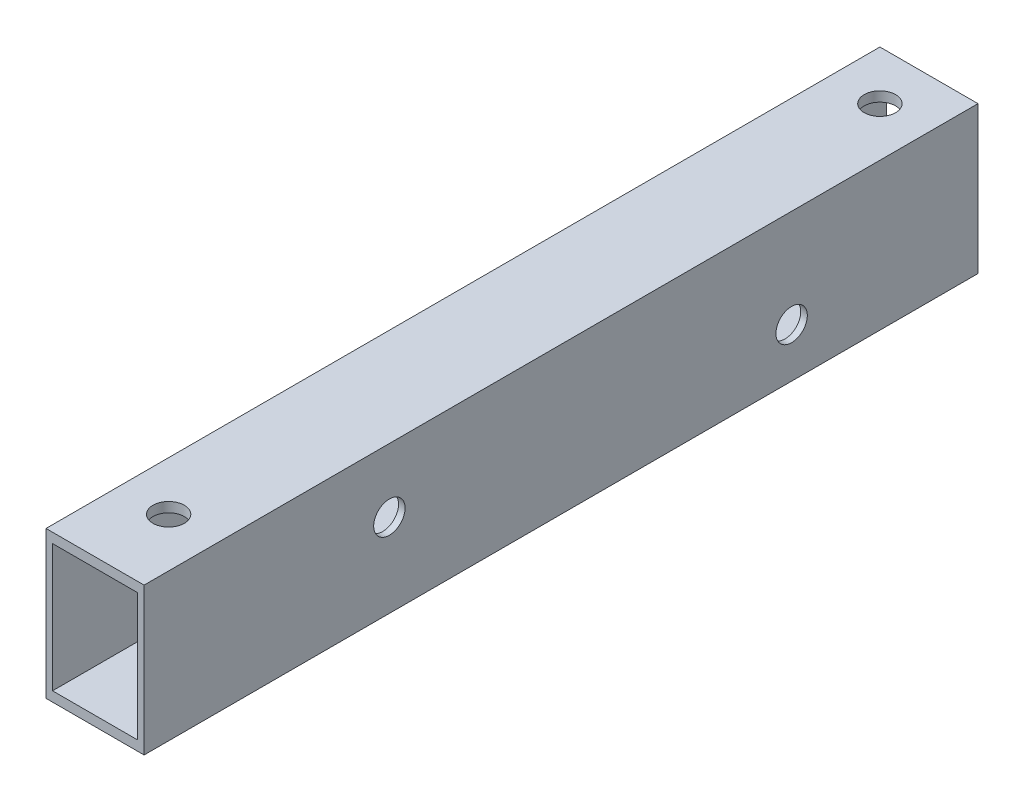
ISO-10303-21;
HEADER;
FILE_DESCRIPTION(('STEP AP214'),'2;1');
FILE_NAME('part.step','',(''),(''),'','','');
FILE_SCHEMA(('AUTOMOTIVE_DESIGN { 1 0 10303 214 1 1 1 1 }'));
ENDSEC;
DATA;
#1=APPLICATION_CONTEXT('core data for automotive mechanical design processes');
#2=APPLICATION_PROTOCOL_DEFINITION('international standard','automotive_design',2000,#1);
#3=PRODUCT_CONTEXT('',#1,'mechanical');
#4=PRODUCT('Part','Part','',(#3));
#5=PRODUCT_RELATED_PRODUCT_CATEGORY('part','',(#4));
#6=PRODUCT_DEFINITION_FORMATION('','',#4);
#7=PRODUCT_DEFINITION_CONTEXT('part definition',#1,'design');
#8=PRODUCT_DEFINITION('design','',#6,#7);
#9=PRODUCT_DEFINITION_SHAPE('','',#8);
#10=(LENGTH_UNIT() NAMED_UNIT(*) SI_UNIT(.MILLI.,.METRE.));
#11=(NAMED_UNIT(*) PLANE_ANGLE_UNIT() SI_UNIT($,.RADIAN.));
#12=(NAMED_UNIT(*) SI_UNIT($,.STERADIAN.) SOLID_ANGLE_UNIT());
#13=UNCERTAINTY_MEASURE_WITH_UNIT(LENGTH_MEASURE(1.E-05),#10,'distance_accuracy_value','');
#14=(GEOMETRIC_REPRESENTATION_CONTEXT(3) GLOBAL_UNCERTAINTY_ASSIGNED_CONTEXT((#13)) GLOBAL_UNIT_ASSIGNED_CONTEXT((#10,
#11,#12)) REPRESENTATION_CONTEXT('',''));
#15=CARTESIAN_POINT('',(0.,0.,0.));
#16=DIRECTION('',(0.,0.,1.));
#17=DIRECTION('',(1.,0.,0.));
#18=AXIS2_PLACEMENT_3D('',#15,#16,#17);
#19=CARTESIAN_POINT('',(0.,0.,85.));
#20=DIRECTION('',(0.,0.,-1.));
#21=DIRECTION('',(-1.,0.,0.));
#22=AXIS2_PLACEMENT_3D('',#19,#20,#21);
#23=PLANE('',#22);
#24=DIRECTION('',(0.,1.,0.));
#25=VECTOR('',#24,1.);
#26=CARTESIAN_POINT('',(5.,-7.5,85.));
#27=LINE('',#26,#25);
#28=CARTESIAN_POINT('',(5.,-7.5,85.));
#29=VERTEX_POINT('',#28);
#30=CARTESIAN_POINT('',(5.,7.5,85.));
#31=VERTEX_POINT('',#30);
#32=EDGE_CURVE('E138',#29,#31,#27,.T.);
#33=ORIENTED_EDGE('',*,*,#32,.T.);
#34=DIRECTION('',(-1.,0.,0.));
#35=VECTOR('',#34,1.);
#36=CARTESIAN_POINT('',(-5.,7.5,85.));
#37=LINE('',#36,#35);
#38=CARTESIAN_POINT('',(-5.,7.5,85.));
#39=VERTEX_POINT('',#38);
#40=EDGE_CURVE('E141',#31,#39,#37,.T.);
#41=ORIENTED_EDGE('',*,*,#40,.T.);
#42=DIRECTION('',(0.,-1.,0.));
#43=VECTOR('',#42,1.);
#44=CARTESIAN_POINT('',(-5.,-7.5,85.));
#45=LINE('',#44,#43);
#46=CARTESIAN_POINT('',(-5.,-7.5,85.));
#47=VERTEX_POINT('',#46);
#48=EDGE_CURVE('E144',#39,#47,#45,.T.);
#49=ORIENTED_EDGE('',*,*,#48,.T.);
#50=DIRECTION('',(1.,0.,0.));
#51=VECTOR('',#50,1.);
#52=CARTESIAN_POINT('',(-5.,-7.5,85.));
#53=LINE('',#52,#51);
#54=EDGE_CURVE('E146',#47,#29,#53,.T.);
#55=ORIENTED_EDGE('',*,*,#54,.T.);
#56=EDGE_LOOP('',(#33,#41,#49,#55));
#57=FACE_BOUND('',#56,.T.);
#58=DIRECTION('',(0.,1.,0.));
#59=VECTOR('',#58,1.);
#60=CARTESIAN_POINT('',(4.33333333333334,-6.5,85.));
#61=LINE('',#60,#59);
#62=CARTESIAN_POINT('',(4.33333333333334,-6.5,85.));
#63=VERTEX_POINT('',#62);
#64=CARTESIAN_POINT('',(4.33333333333334,6.5,85.));
#65=VERTEX_POINT('',#64);
#66=EDGE_CURVE('E100',#63,#65,#61,.T.);
#67=ORIENTED_EDGE('',*,*,#66,.F.);
#68=DIRECTION('',(1.,0.,0.));
#69=VECTOR('',#68,1.);
#70=CARTESIAN_POINT('',(-4.33333333333333,-6.5,85.));
#71=LINE('',#70,#69);
#72=CARTESIAN_POINT('',(-4.33333333333333,-6.5,85.));
#73=VERTEX_POINT('',#72);
#74=EDGE_CURVE('E122',#73,#63,#71,.T.);
#75=ORIENTED_EDGE('',*,*,#74,.F.);
#76=DIRECTION('',(0.,-1.,0.));
#77=VECTOR('',#76,1.);
#78=CARTESIAN_POINT('',(-4.33333333333333,-6.5,85.));
#79=LINE('',#78,#77);
#80=CARTESIAN_POINT('',(-4.33333333333333,6.5,85.));
#81=VERTEX_POINT('',#80);
#82=EDGE_CURVE('E120',#81,#73,#79,.T.);
#83=ORIENTED_EDGE('',*,*,#82,.F.);
#84=DIRECTION('',(-1.,0.,0.));
#85=VECTOR('',#84,1.);
#86=CARTESIAN_POINT('',(-4.33333333333333,6.5,85.));
#87=LINE('',#86,#85);
#88=EDGE_CURVE('E108',#65,#81,#87,.T.);
#89=ORIENTED_EDGE('',*,*,#88,.F.);
#90=EDGE_LOOP('',(#67,#75,#83,#89));
#91=FACE_BOUND('',#90,.T.);
#92=ADVANCED_FACE('F33',(#57,#91),#23,.F.);
#93=CARTESIAN_POINT('',(0.,0.,0.));
#94=DIRECTION('',(0.,0.,-1.));
#95=DIRECTION('',(-1.,0.,0.));
#96=AXIS2_PLACEMENT_3D('',#93,#94,#95);
#97=PLANE('',#96);
#98=DIRECTION('',(0.,1.,0.));
#99=VECTOR('',#98,1.);
#100=CARTESIAN_POINT('',(5.,-7.5,0.));
#101=LINE('',#100,#99);
#102=CARTESIAN_POINT('',(5.,-7.5,0.));
#103=VERTEX_POINT('',#102);
#104=CARTESIAN_POINT('',(5.,7.5,0.));
#105=VERTEX_POINT('',#104);
#106=EDGE_CURVE('E116',#103,#105,#101,.T.);
#107=ORIENTED_EDGE('',*,*,#106,.F.);
#108=DIRECTION('',(1.,0.,0.));
#109=VECTOR('',#108,1.);
#110=CARTESIAN_POINT('',(-5.,-7.5,0.));
#111=LINE('',#110,#109);
#112=CARTESIAN_POINT('',(-5.,-7.5,0.));
#113=VERTEX_POINT('',#112);
#114=EDGE_CURVE('E142',#113,#103,#111,.T.);
#115=ORIENTED_EDGE('',*,*,#114,.F.);
#116=DIRECTION('',(0.,-1.,0.));
#117=VECTOR('',#116,1.);
#118=CARTESIAN_POINT('',(-5.,-7.5,0.));
#119=LINE('',#118,#117);
#120=CARTESIAN_POINT('',(-5.,7.5,0.));
#121=VERTEX_POINT('',#120);
#122=EDGE_CURVE('E153',#121,#113,#119,.T.);
#123=ORIENTED_EDGE('',*,*,#122,.F.);
#124=DIRECTION('',(-1.,0.,0.));
#125=VECTOR('',#124,1.);
#126=CARTESIAN_POINT('',(-5.,7.5,0.));
#127=LINE('',#126,#125);
#128=EDGE_CURVE('E151',#105,#121,#127,.T.);
#129=ORIENTED_EDGE('',*,*,#128,.F.);
#130=EDGE_LOOP('',(#107,#115,#123,#129));
#131=FACE_BOUND('',#130,.T.);
#132=DIRECTION('',(1.,0.,0.));
#133=VECTOR('',#132,1.);
#134=CARTESIAN_POINT('',(-4.33333333333333,-6.5,0.));
#135=LINE('',#134,#133);
#136=CARTESIAN_POINT('',(-4.33333333333333,-6.5,0.));
#137=VERTEX_POINT('',#136);
#138=CARTESIAN_POINT('',(4.33333333333334,-6.5,0.));
#139=VERTEX_POINT('',#138);
#140=EDGE_CURVE('E109',#137,#139,#135,.T.);
#141=ORIENTED_EDGE('',*,*,#140,.T.);
#142=DIRECTION('',(0.,1.,0.));
#143=VECTOR('',#142,1.);
#144=CARTESIAN_POINT('',(4.33333333333334,-6.5,0.));
#145=LINE('',#144,#143);
#146=CARTESIAN_POINT('',(4.33333333333334,6.5,0.));
#147=VERTEX_POINT('',#146);
#148=EDGE_CURVE('E58',#139,#147,#145,.T.);
#149=ORIENTED_EDGE('',*,*,#148,.T.);
#150=DIRECTION('',(-1.,0.,0.));
#151=VECTOR('',#150,1.);
#152=CARTESIAN_POINT('',(-4.33333333333333,6.5,0.));
#153=LINE('',#152,#151);
#154=CARTESIAN_POINT('',(-4.33333333333333,6.5,0.));
#155=VERTEX_POINT('',#154);
#156=EDGE_CURVE('E115',#147,#155,#153,.T.);
#157=ORIENTED_EDGE('',*,*,#156,.T.);
#158=DIRECTION('',(0.,-1.,0.));
#159=VECTOR('',#158,1.);
#160=CARTESIAN_POINT('',(-4.33333333333333,-6.5,0.));
#161=LINE('',#160,#159);
#162=EDGE_CURVE('E130',#155,#137,#161,.T.);
#163=ORIENTED_EDGE('',*,*,#162,.T.);
#164=EDGE_LOOP('',(#141,#149,#157,#163));
#165=FACE_BOUND('',#164,.T.);
#166=ADVANCED_FACE('F241',(#131,#165),#97,.T.);
#167=CARTESIAN_POINT('',(5.,-7.5,85.));
#168=DIRECTION('',(-1.,0.,0.));
#169=DIRECTION('',(0.,0.,1.));
#170=AXIS2_PLACEMENT_3D('',#167,#168,#169);
#171=PLANE('',#170);
#172=CARTESIAN_POINT('',(5.,1.,60.));
#173=DIRECTION('',(-1.,0.,0.));
#174=DIRECTION('',(0.,0.,1.));
#175=AXIS2_PLACEMENT_3D('',#172,#173,#174);
#176=CIRCLE('',#175,1.60000000000001);
#177=CARTESIAN_POINT('',(5.,1.,61.6));
#178=VERTEX_POINT('',#177);
#179=EDGE_CURVE('E173',#178,#178,#176,.T.);
#180=ORIENTED_EDGE('',*,*,#179,.T.);
#181=EDGE_LOOP('',(#180));
#182=FACE_BOUND('',#181,.T.);
#183=CARTESIAN_POINT('',(5.,-2.5,19.));
#184=DIRECTION('',(-1.,0.,0.));
#185=DIRECTION('',(0.,0.,1.));
#186=AXIS2_PLACEMENT_3D('',#183,#184,#185);
#187=CIRCLE('',#186,1.6);
#188=CARTESIAN_POINT('',(5.,-2.5,20.6));
#189=VERTEX_POINT('',#188);
#190=EDGE_CURVE('E184',#189,#189,#187,.T.);
#191=ORIENTED_EDGE('',*,*,#190,.T.);
#192=EDGE_LOOP('',(#191));
#193=FACE_BOUND('',#192,.T.);
#194=ORIENTED_EDGE('',*,*,#106,.T.);
#195=DIRECTION('',(0.,0.,-1.));
#196=VECTOR('',#195,1.);
#197=CARTESIAN_POINT('',(5.,7.5,85.));
#198=LINE('',#197,#196);
#199=EDGE_CURVE('E11',#31,#105,#198,.T.);
#200=ORIENTED_EDGE('',*,*,#199,.F.);
#201=ORIENTED_EDGE('',*,*,#32,.F.);
#202=DIRECTION('',(0.,0.,-1.));
#203=VECTOR('',#202,1.);
#204=CARTESIAN_POINT('',(5.,-7.5,85.));
#205=LINE('',#204,#203);
#206=EDGE_CURVE('E148',#29,#103,#205,.T.);
#207=ORIENTED_EDGE('',*,*,#206,.T.);
#208=EDGE_LOOP('',(#194,#200,#201,#207));
#209=FACE_BOUND('',#208,.T.);
#210=ADVANCED_FACE('F35',(#182,#193,#209),#171,.F.);
#211=CARTESIAN_POINT('',(-5.,7.5,85.));
#212=DIRECTION('',(0.,-1.,0.));
#213=DIRECTION('',(0.,0.,-1.));
#214=AXIS2_PLACEMENT_3D('',#211,#212,#213);
#215=PLANE('',#214);
#216=CARTESIAN_POINT('',(0.,7.5,77.5));
#217=DIRECTION('',(0.,1.,0.));
#218=DIRECTION('',(0.,0.,1.));
#219=AXIS2_PLACEMENT_3D('',#216,#217,#218);
#220=CIRCLE('',#219,1.6);
#221=CARTESIAN_POINT('',(0.,7.5,79.1));
#222=VERTEX_POINT('',#221);
#223=EDGE_CURVE('E198',#222,#222,#220,.T.);
#224=ORIENTED_EDGE('',*,*,#223,.F.);
#225=EDGE_LOOP('',(#224));
#226=FACE_BOUND('',#225,.T.);
#227=CARTESIAN_POINT('',(0.,7.5,5.));
#228=DIRECTION('',(0.,1.,0.));
#229=DIRECTION('',(0.,0.,1.));
#230=AXIS2_PLACEMENT_3D('',#227,#228,#229);
#231=CIRCLE('',#230,1.6);
#232=CARTESIAN_POINT('',(0.,7.5,6.6));
#233=VERTEX_POINT('',#232);
#234=EDGE_CURVE('E195',#233,#233,#231,.T.);
#235=ORIENTED_EDGE('',*,*,#234,.F.);
#236=EDGE_LOOP('',(#235));
#237=FACE_BOUND('',#236,.T.);
#238=ORIENTED_EDGE('',*,*,#128,.T.);
#239=DIRECTION('',(0.,0.,-1.));
#240=VECTOR('',#239,1.);
#241=CARTESIAN_POINT('',(-5.,7.5,85.));
#242=LINE('',#241,#240);
#243=EDGE_CURVE('E42',#39,#121,#242,.T.);
#244=ORIENTED_EDGE('',*,*,#243,.F.);
#245=ORIENTED_EDGE('',*,*,#40,.F.);
#246=ORIENTED_EDGE('',*,*,#199,.T.);
#247=EDGE_LOOP('',(#238,#244,#245,#246));
#248=FACE_BOUND('',#247,.T.);
#249=ADVANCED_FACE('F227',(#226,#237,#248),#215,.F.);
#250=CARTESIAN_POINT('',(-5.,-7.5,85.));
#251=DIRECTION('',(1.,0.,0.));
#252=DIRECTION('',(0.,0.,-1.));
#253=AXIS2_PLACEMENT_3D('',#250,#251,#252);
#254=PLANE('',#253);
#255=CARTESIAN_POINT('',(-5.,1.,60.));
#256=DIRECTION('',(-1.,0.,0.));
#257=DIRECTION('',(0.,0.,1.));
#258=AXIS2_PLACEMENT_3D('',#255,#256,#257);
#259=CIRCLE('',#258,1.60000000000001);
#260=CARTESIAN_POINT('',(-5.,1.,61.6));
#261=VERTEX_POINT('',#260);
#262=EDGE_CURVE('E179',#261,#261,#259,.T.);
#263=ORIENTED_EDGE('',*,*,#262,.F.);
#264=EDGE_LOOP('',(#263));
#265=FACE_BOUND('',#264,.T.);
#266=CARTESIAN_POINT('',(-5.,-2.5,19.));
#267=DIRECTION('',(-1.,0.,0.));
#268=DIRECTION('',(0.,0.,1.));
#269=AXIS2_PLACEMENT_3D('',#266,#267,#268);
#270=CIRCLE('',#269,1.6);
#271=CARTESIAN_POINT('',(-5.,-2.5,20.6));
#272=VERTEX_POINT('',#271);
#273=EDGE_CURVE('E189',#272,#272,#270,.T.);
#274=ORIENTED_EDGE('',*,*,#273,.F.);
#275=EDGE_LOOP('',(#274));
#276=FACE_BOUND('',#275,.T.);
#277=ORIENTED_EDGE('',*,*,#122,.T.);
#278=DIRECTION('',(0.,0.,-1.));
#279=VECTOR('',#278,1.);
#280=CARTESIAN_POINT('',(-5.,-7.5,85.));
#281=LINE('',#280,#279);
#282=EDGE_CURVE('E158',#47,#113,#281,.T.);
#283=ORIENTED_EDGE('',*,*,#282,.F.);
#284=ORIENTED_EDGE('',*,*,#48,.F.);
#285=ORIENTED_EDGE('',*,*,#243,.T.);
#286=EDGE_LOOP('',(#277,#283,#284,#285));
#287=FACE_BOUND('',#286,.T.);
#288=ADVANCED_FACE('F230',(#265,#276,#287),#254,.F.);
#289=CARTESIAN_POINT('',(-5.,-7.5,85.));
#290=DIRECTION('',(0.,1.,0.));
#291=DIRECTION('',(0.,0.,1.));
#292=AXIS2_PLACEMENT_3D('',#289,#290,#291);
#293=PLANE('',#292);
#294=CARTESIAN_POINT('',(0.,-7.5,77.5));
#295=DIRECTION('',(0.,1.,0.));
#296=DIRECTION('',(0.,0.,1.));
#297=AXIS2_PLACEMENT_3D('',#294,#295,#296);
#298=CIRCLE('',#297,1.6);
#299=CARTESIAN_POINT('',(0.,-7.5,79.1));
#300=VERTEX_POINT('',#299);
#301=EDGE_CURVE('E167',#300,#300,#298,.T.);
#302=ORIENTED_EDGE('',*,*,#301,.T.);
#303=EDGE_LOOP('',(#302));
#304=FACE_BOUND('',#303,.T.);
#305=CARTESIAN_POINT('',(0.,-7.5,5.));
#306=DIRECTION('',(0.,1.,0.));
#307=DIRECTION('',(0.,0.,1.));
#308=AXIS2_PLACEMENT_3D('',#305,#306,#307);
#309=CIRCLE('',#308,1.6);
#310=CARTESIAN_POINT('',(0.,-7.5,6.6));
#311=VERTEX_POINT('',#310);
#312=EDGE_CURVE('E201',#311,#311,#309,.T.);
#313=ORIENTED_EDGE('',*,*,#312,.T.);
#314=EDGE_LOOP('',(#313));
#315=FACE_BOUND('',#314,.T.);
#316=ORIENTED_EDGE('',*,*,#114,.T.);
#317=ORIENTED_EDGE('',*,*,#206,.F.);
#318=ORIENTED_EDGE('',*,*,#54,.F.);
#319=ORIENTED_EDGE('',*,*,#282,.T.);
#320=EDGE_LOOP('',(#316,#317,#318,#319));
#321=FACE_BOUND('',#320,.T.);
#322=ADVANCED_FACE('F245',(#304,#315,#321),#293,.F.);
#323=CARTESIAN_POINT('',(4.33333333333334,-6.5,85.));
#324=DIRECTION('',(-1.,0.,0.));
#325=DIRECTION('',(0.,0.,1.));
#326=AXIS2_PLACEMENT_3D('',#323,#324,#325);
#327=PLANE('',#326);
#328=CARTESIAN_POINT('',(4.33333333333334,1.,60.));
#329=DIRECTION('',(-1.,0.,0.));
#330=DIRECTION('',(0.,0.,1.));
#331=AXIS2_PLACEMENT_3D('',#328,#329,#330);
#332=CIRCLE('',#331,1.60000000000001);
#333=CARTESIAN_POINT('',(4.33333333333334,1.,61.6));
#334=VERTEX_POINT('',#333);
#335=EDGE_CURVE('E192',#334,#334,#332,.T.);
#336=ORIENTED_EDGE('',*,*,#335,.F.);
#337=EDGE_LOOP('',(#336));
#338=FACE_BOUND('',#337,.T.);
#339=CARTESIAN_POINT('',(4.33333333333334,-2.5,19.));
#340=DIRECTION('',(-1.,0.,0.));
#341=DIRECTION('',(0.,0.,1.));
#342=AXIS2_PLACEMENT_3D('',#339,#340,#341);
#343=CIRCLE('',#342,1.6);
#344=CARTESIAN_POINT('',(4.33333333333334,-2.5,20.6));
#345=VERTEX_POINT('',#344);
#346=EDGE_CURVE('E172',#345,#345,#343,.T.);
#347=ORIENTED_EDGE('',*,*,#346,.F.);
#348=EDGE_LOOP('',(#347));
#349=FACE_BOUND('',#348,.T.);
#350=ORIENTED_EDGE('',*,*,#148,.F.);
#351=DIRECTION('',(0.,0.,-1.));
#352=VECTOR('',#351,1.);
#353=CARTESIAN_POINT('',(4.33333333333334,-6.5,85.));
#354=LINE('',#353,#352);
#355=EDGE_CURVE('E104',#63,#139,#354,.T.);
#356=ORIENTED_EDGE('',*,*,#355,.F.);
#357=ORIENTED_EDGE('',*,*,#66,.T.);
#358=DIRECTION('',(0.,0.,-1.));
#359=VECTOR('',#358,1.);
#360=CARTESIAN_POINT('',(4.33333333333334,6.5,85.));
#361=LINE('',#360,#359);
#362=EDGE_CURVE('E103',#65,#147,#361,.T.);
#363=ORIENTED_EDGE('',*,*,#362,.T.);
#364=EDGE_LOOP('',(#350,#356,#357,#363));
#365=FACE_BOUND('',#364,.T.);
#366=ADVANCED_FACE('F102',(#338,#349,#365),#327,.T.);
#367=CARTESIAN_POINT('',(-4.33333333333333,6.5,85.));
#368=DIRECTION('',(0.,-1.,0.));
#369=DIRECTION('',(0.,0.,-1.));
#370=AXIS2_PLACEMENT_3D('',#367,#368,#369);
#371=PLANE('',#370);
#372=CARTESIAN_POINT('',(0.,6.5,77.5));
#373=DIRECTION('',(0.,-1.,0.));
#374=DIRECTION('',(0.,0.,-1.));
#375=AXIS2_PLACEMENT_3D('',#372,#373,#374);
#376=CIRCLE('',#375,1.6);
#377=CARTESIAN_POINT('',(0.,6.5,75.9));
#378=VERTEX_POINT('',#377);
#379=EDGE_CURVE('E128',#378,#378,#376,.T.);
#380=ORIENTED_EDGE('',*,*,#379,.F.);
#381=EDGE_LOOP('',(#380));
#382=FACE_BOUND('',#381,.T.);
#383=CARTESIAN_POINT('',(0.,6.5,5.));
#384=DIRECTION('',(0.,-1.,0.));
#385=DIRECTION('',(0.,0.,-1.));
#386=AXIS2_PLACEMENT_3D('',#383,#384,#385);
#387=CIRCLE('',#386,1.6);
#388=CARTESIAN_POINT('',(0.,6.5,3.4));
#389=VERTEX_POINT('',#388);
#390=EDGE_CURVE('E166',#389,#389,#387,.T.);
#391=ORIENTED_EDGE('',*,*,#390,.F.);
#392=EDGE_LOOP('',(#391));
#393=FACE_BOUND('',#392,.T.);
#394=ORIENTED_EDGE('',*,*,#156,.F.);
#395=ORIENTED_EDGE('',*,*,#362,.F.);
#396=ORIENTED_EDGE('',*,*,#88,.T.);
#397=DIRECTION('',(0.,0.,-1.));
#398=VECTOR('',#397,1.);
#399=CARTESIAN_POINT('',(-4.33333333333333,6.5,85.));
#400=LINE('',#399,#398);
#401=EDGE_CURVE('E117',#81,#155,#400,.T.);
#402=ORIENTED_EDGE('',*,*,#401,.T.);
#403=EDGE_LOOP('',(#394,#395,#396,#402));
#404=FACE_BOUND('',#403,.T.);
#405=ADVANCED_FACE('F112',(#382,#393,#404),#371,.T.);
#406=CARTESIAN_POINT('',(-4.33333333333333,-6.5,85.));
#407=DIRECTION('',(1.,0.,0.));
#408=DIRECTION('',(0.,0.,-1.));
#409=AXIS2_PLACEMENT_3D('',#406,#407,#408);
#410=PLANE('',#409);
#411=CARTESIAN_POINT('',(-4.33333333333334,1.,60.));
#412=DIRECTION('',(1.,0.,0.));
#413=DIRECTION('',(0.,0.,-1.));
#414=AXIS2_PLACEMENT_3D('',#411,#412,#413);
#415=CIRCLE('',#414,1.60000000000001);
#416=CARTESIAN_POINT('',(-4.33333333333334,1.,58.4));
#417=VERTEX_POINT('',#416);
#418=EDGE_CURVE('E37',#417,#417,#415,.T.);
#419=ORIENTED_EDGE('',*,*,#418,.F.);
#420=EDGE_LOOP('',(#419));
#421=FACE_BOUND('',#420,.T.);
#422=CARTESIAN_POINT('',(-4.33333333333334,-2.5,19.));
#423=DIRECTION('',(1.,0.,0.));
#424=DIRECTION('',(0.,0.,-1.));
#425=AXIS2_PLACEMENT_3D('',#422,#423,#424);
#426=CIRCLE('',#425,1.6);
#427=CARTESIAN_POINT('',(-4.33333333333334,-2.5,17.4));
#428=VERTEX_POINT('',#427);
#429=EDGE_CURVE('E170',#428,#428,#426,.T.);
#430=ORIENTED_EDGE('',*,*,#429,.F.);
#431=EDGE_LOOP('',(#430));
#432=FACE_BOUND('',#431,.T.);
#433=ORIENTED_EDGE('',*,*,#162,.F.);
#434=ORIENTED_EDGE('',*,*,#401,.F.);
#435=ORIENTED_EDGE('',*,*,#82,.T.);
#436=DIRECTION('',(0.,0.,-1.));
#437=VECTOR('',#436,1.);
#438=CARTESIAN_POINT('',(-4.33333333333333,-6.5,85.));
#439=LINE('',#438,#437);
#440=EDGE_CURVE('E50',#73,#137,#439,.T.);
#441=ORIENTED_EDGE('',*,*,#440,.T.);
#442=EDGE_LOOP('',(#433,#434,#435,#441));
#443=FACE_BOUND('',#442,.T.);
#444=ADVANCED_FACE('F215',(#421,#432,#443),#410,.T.);
#445=CARTESIAN_POINT('',(-4.33333333333333,-6.5,85.));
#446=DIRECTION('',(0.,1.,0.));
#447=DIRECTION('',(0.,0.,1.));
#448=AXIS2_PLACEMENT_3D('',#445,#446,#447);
#449=PLANE('',#448);
#450=CARTESIAN_POINT('',(0.,-6.5,77.5));
#451=DIRECTION('',(0.,1.,0.));
#452=DIRECTION('',(0.,0.,1.));
#453=AXIS2_PLACEMENT_3D('',#450,#451,#452);
#454=CIRCLE('',#453,1.6);
#455=CARTESIAN_POINT('',(0.,-6.5,79.1));
#456=VERTEX_POINT('',#455);
#457=EDGE_CURVE('E168',#456,#456,#454,.T.);
#458=ORIENTED_EDGE('',*,*,#457,.F.);
#459=EDGE_LOOP('',(#458));
#460=FACE_BOUND('',#459,.T.);
#461=CARTESIAN_POINT('',(0.,-6.5,5.));
#462=DIRECTION('',(0.,1.,0.));
#463=DIRECTION('',(0.,0.,1.));
#464=AXIS2_PLACEMENT_3D('',#461,#462,#463);
#465=CIRCLE('',#464,1.6);
#466=CARTESIAN_POINT('',(0.,-6.5,6.6));
#467=VERTEX_POINT('',#466);
#468=EDGE_CURVE('E163',#467,#467,#465,.T.);
#469=ORIENTED_EDGE('',*,*,#468,.F.);
#470=EDGE_LOOP('',(#469));
#471=FACE_BOUND('',#470,.T.);
#472=ORIENTED_EDGE('',*,*,#140,.F.);
#473=ORIENTED_EDGE('',*,*,#440,.F.);
#474=ORIENTED_EDGE('',*,*,#74,.T.);
#475=ORIENTED_EDGE('',*,*,#355,.T.);
#476=EDGE_LOOP('',(#472,#473,#474,#475));
#477=FACE_BOUND('',#476,.T.);
#478=ADVANCED_FACE('F326',(#460,#471,#477),#449,.T.);
#479=CARTESIAN_POINT('',(0.,-7.5,5.));
#480=DIRECTION('',(0.,1.,0.));
#481=DIRECTION('',(0.,0.,1.));
#482=AXIS2_PLACEMENT_3D('',#479,#480,#481);
#483=CYLINDRICAL_SURFACE('',#482,1.6);
#484=ORIENTED_EDGE('',*,*,#468,.T.);
#485=EDGE_LOOP('',(#484));
#486=FACE_BOUND('',#485,.T.);
#487=ORIENTED_EDGE('',*,*,#312,.F.);
#488=EDGE_LOOP('',(#487));
#489=FACE_BOUND('',#488,.T.);
#490=ADVANCED_FACE('F224',(#486,#489),#483,.F.);
#491=CARTESIAN_POINT('',(0.,-7.5,77.5));
#492=DIRECTION('',(0.,1.,0.));
#493=DIRECTION('',(0.,0.,1.));
#494=AXIS2_PLACEMENT_3D('',#491,#492,#493);
#495=CYLINDRICAL_SURFACE('',#494,1.6);
#496=ORIENTED_EDGE('',*,*,#457,.T.);
#497=EDGE_LOOP('',(#496));
#498=FACE_BOUND('',#497,.T.);
#499=ORIENTED_EDGE('',*,*,#301,.F.);
#500=EDGE_LOOP('',(#499));
#501=FACE_BOUND('',#500,.T.);
#502=ADVANCED_FACE('F222',(#498,#501),#495,.F.);
#503=ORIENTED_EDGE('',*,*,#390,.T.);
#504=EDGE_LOOP('',(#503));
#505=FACE_BOUND('',#504,.T.);
#506=ORIENTED_EDGE('',*,*,#234,.T.);
#507=EDGE_LOOP('',(#506));
#508=FACE_BOUND('',#507,.T.);
#509=ADVANCED_FACE('F219',(#505,#508),#483,.F.);
#510=ORIENTED_EDGE('',*,*,#379,.T.);
#511=EDGE_LOOP('',(#510));
#512=FACE_BOUND('',#511,.T.);
#513=ORIENTED_EDGE('',*,*,#223,.T.);
#514=EDGE_LOOP('',(#513));
#515=FACE_BOUND('',#514,.T.);
#516=ADVANCED_FACE('F210',(#512,#515),#495,.F.);
#517=CARTESIAN_POINT('',(5.,-2.5,19.));
#518=DIRECTION('',(-1.,0.,0.));
#519=DIRECTION('',(0.,0.,1.));
#520=AXIS2_PLACEMENT_3D('',#517,#518,#519);
#521=CYLINDRICAL_SURFACE('',#520,1.6);
#522=ORIENTED_EDGE('',*,*,#429,.T.);
#523=EDGE_LOOP('',(#522));
#524=FACE_BOUND('',#523,.T.);
#525=ORIENTED_EDGE('',*,*,#273,.T.);
#526=EDGE_LOOP('',(#525));
#527=FACE_BOUND('',#526,.T.);
#528=ADVANCED_FACE('F269',(#524,#527),#521,.F.);
#529=CARTESIAN_POINT('',(5.,1.,60.));
#530=DIRECTION('',(-1.,0.,0.));
#531=DIRECTION('',(0.,0.,1.));
#532=AXIS2_PLACEMENT_3D('',#529,#530,#531);
#533=CYLINDRICAL_SURFACE('',#532,1.60000000000001);
#534=ORIENTED_EDGE('',*,*,#418,.T.);
#535=EDGE_LOOP('',(#534));
#536=FACE_BOUND('',#535,.T.);
#537=ORIENTED_EDGE('',*,*,#262,.T.);
#538=EDGE_LOOP('',(#537));
#539=FACE_BOUND('',#538,.T.);
#540=ADVANCED_FACE('F271',(#536,#539),#533,.F.);
#541=ORIENTED_EDGE('',*,*,#346,.T.);
#542=EDGE_LOOP('',(#541));
#543=FACE_BOUND('',#542,.T.);
#544=ORIENTED_EDGE('',*,*,#190,.F.);
#545=EDGE_LOOP('',(#544));
#546=FACE_BOUND('',#545,.T.);
#547=ADVANCED_FACE('F273',(#543,#546),#521,.F.);
#548=ORIENTED_EDGE('',*,*,#335,.T.);
#549=EDGE_LOOP('',(#548));
#550=FACE_BOUND('',#549,.T.);
#551=ORIENTED_EDGE('',*,*,#179,.F.);
#552=EDGE_LOOP('',(#551));
#553=FACE_BOUND('',#552,.T.);
#554=ADVANCED_FACE('F280',(#550,#553),#533,.F.);
#555=CLOSED_SHELL('',(#92,#166,#210,#249,#288,#322,#366,#405,#444,#478,#490,#502,#509,#516,#528,
#540,#547,#554));
#556=MANIFOLD_SOLID_BREP('B2',#555);
#557=ADVANCED_BREP_SHAPE_REPRESENTATION('',(#18,#556),#14);
#558=SHAPE_DEFINITION_REPRESENTATION(#9,#557);
ENDSEC;
END-ISO-10303-21;
